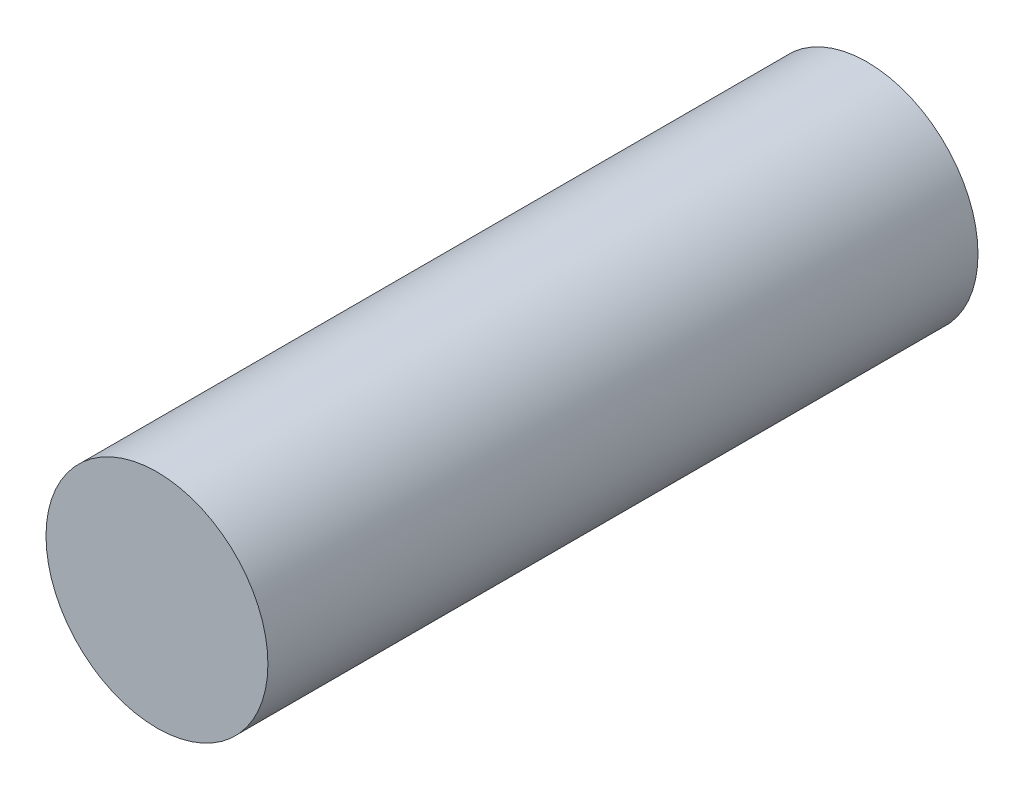
ISO-10303-21;
HEADER;
FILE_DESCRIPTION(('STEP AP214'),'2;1');
FILE_NAME('part.step','',(''),(''),'','','');
FILE_SCHEMA(('AUTOMOTIVE_DESIGN { 1 0 10303 214 1 1 1 1 }'));
ENDSEC;
DATA;
#1=APPLICATION_CONTEXT('core data for automotive mechanical design processes');
#2=APPLICATION_PROTOCOL_DEFINITION('international standard','automotive_design',2000,#1);
#3=PRODUCT_CONTEXT('',#1,'mechanical');
#4=PRODUCT('Part','Part','',(#3));
#5=PRODUCT_RELATED_PRODUCT_CATEGORY('part','',(#4));
#6=PRODUCT_DEFINITION_FORMATION('','',#4);
#7=PRODUCT_DEFINITION_CONTEXT('part definition',#1,'design');
#8=PRODUCT_DEFINITION('design','',#6,#7);
#9=PRODUCT_DEFINITION_SHAPE('','',#8);
#10=(LENGTH_UNIT() NAMED_UNIT(*) SI_UNIT(.MILLI.,.METRE.));
#11=(NAMED_UNIT(*) PLANE_ANGLE_UNIT() SI_UNIT($,.RADIAN.));
#12=(NAMED_UNIT(*) SI_UNIT($,.STERADIAN.) SOLID_ANGLE_UNIT());
#13=UNCERTAINTY_MEASURE_WITH_UNIT(LENGTH_MEASURE(1.E-05),#10,'distance_accuracy_value','');
#14=(GEOMETRIC_REPRESENTATION_CONTEXT(3) GLOBAL_UNCERTAINTY_ASSIGNED_CONTEXT((#13)) GLOBAL_UNIT_ASSIGNED_CONTEXT((#10,
#11,#12)) REPRESENTATION_CONTEXT('',''));
#15=CARTESIAN_POINT('',(0.,0.,0.));
#16=DIRECTION('',(0.,0.,1.));
#17=DIRECTION('',(1.,0.,0.));
#18=AXIS2_PLACEMENT_3D('',#15,#16,#17);
#19=CARTESIAN_POINT('',(0.499999,0.,0.));
#20=DIRECTION('',(0.,0.,-1.));
#21=DIRECTION('',(-1.,0.,0.));
#22=AXIS2_PLACEMENT_3D('',#19,#20,#21);
#23=PLANE('',#22);
#24=CARTESIAN_POINT('',(0.,0.,0.));
#25=DIRECTION('',(0.,0.,-1.));
#26=DIRECTION('',(-1.,0.,0.));
#27=AXIS2_PLACEMENT_3D('',#24,#25,#26);
#28=CIRCLE('',#27,0.499999);
#29=CARTESIAN_POINT('',(-0.499999,0.,0.));
#30=VERTEX_POINT('',#29);
#31=EDGE_CURVE('E18',#30,#30,#28,.F.);
#32=ORIENTED_EDGE('',*,*,#31,.F.);
#33=EDGE_LOOP('',(#32));
#34=FACE_BOUND('',#33,.T.);
#35=ADVANCED_FACE('F15',(#34),#23,.T.);
#36=CARTESIAN_POINT('',(0.499999,0.,3.20000122));
#37=DIRECTION('',(0.,0.,-1.));
#38=DIRECTION('',(-1.,0.,0.));
#39=AXIS2_PLACEMENT_3D('',#36,#37,#38);
#40=PLANE('',#39);
#41=CARTESIAN_POINT('',(0.,0.,3.20000122));
#42=DIRECTION('',(0.,0.,-1.));
#43=DIRECTION('',(-1.,0.,0.));
#44=AXIS2_PLACEMENT_3D('',#41,#42,#43);
#45=CIRCLE('',#44,0.499999);
#46=CARTESIAN_POINT('',(-0.499999,0.,3.20000122));
#47=VERTEX_POINT('',#46);
#48=EDGE_CURVE('E10',#47,#47,#45,.T.);
#49=ORIENTED_EDGE('',*,*,#48,.F.);
#50=EDGE_LOOP('',(#49));
#51=FACE_BOUND('',#50,.T.);
#52=ADVANCED_FACE('F30',(#51),#40,.F.);
#53=CARTESIAN_POINT('',(0.,0.,0.));
#54=DIRECTION('',(0.,0.,-1.));
#55=DIRECTION('',(-1.,0.,0.));
#56=AXIS2_PLACEMENT_3D('',#53,#54,#55);
#57=CYLINDRICAL_SURFACE('',#56,0.499999);
#58=ORIENTED_EDGE('',*,*,#31,.T.);
#59=EDGE_LOOP('',(#58));
#60=FACE_BOUND('',#59,.T.);
#61=ORIENTED_EDGE('',*,*,#48,.T.);
#62=EDGE_LOOP('',(#61));
#63=FACE_BOUND('',#62,.T.);
#64=ADVANCED_FACE('F27',(#60,#63),#57,.T.);
#65=CLOSED_SHELL('',(#35,#52,#64));
#66=MANIFOLD_SOLID_BREP('B1',#65);
#67=ADVANCED_BREP_SHAPE_REPRESENTATION('',(#18,#66),#14);
#68=SHAPE_DEFINITION_REPRESENTATION(#9,#67);
ENDSEC;
END-ISO-10303-21;
